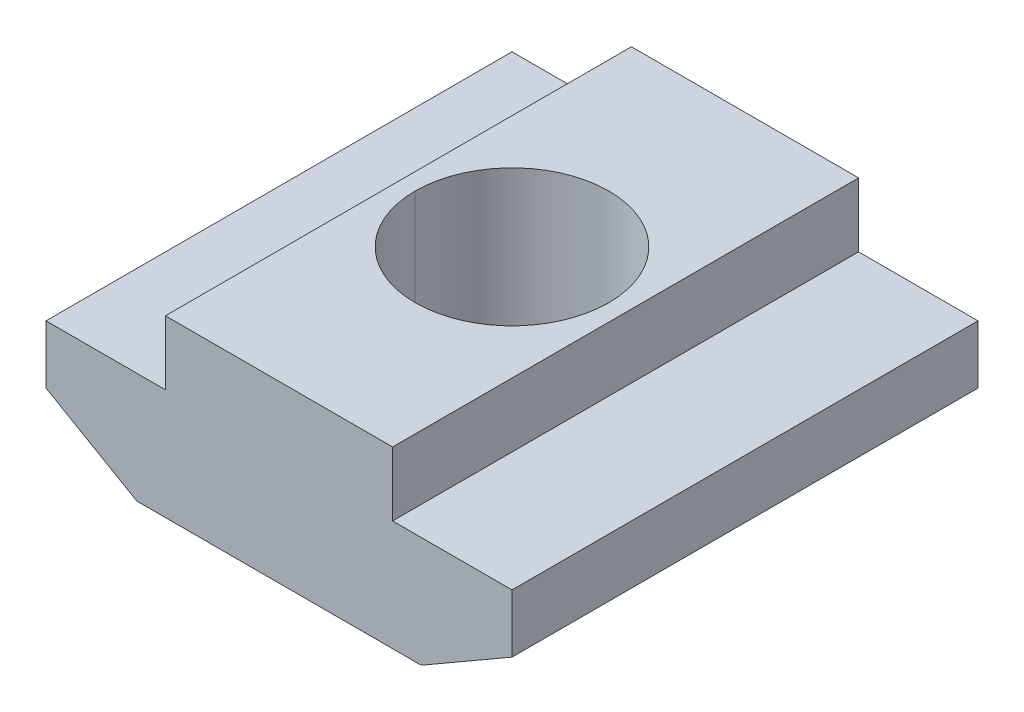
ISO-10303-21;
HEADER;
FILE_DESCRIPTION(('STEP AP214'),'2;1');
FILE_NAME('part.step','',(''),(''),'','','');
FILE_SCHEMA(('AUTOMOTIVE_DESIGN { 1 0 10303 214 1 1 1 1 }'));
ENDSEC;
DATA;
#1=APPLICATION_CONTEXT('core data for automotive mechanical design processes');
#2=APPLICATION_PROTOCOL_DEFINITION('international standard','automotive_design',2000,#1);
#3=PRODUCT_CONTEXT('',#1,'mechanical');
#4=PRODUCT('Part','Part','',(#3));
#5=PRODUCT_RELATED_PRODUCT_CATEGORY('part','',(#4));
#6=PRODUCT_DEFINITION_FORMATION('','',#4);
#7=PRODUCT_DEFINITION_CONTEXT('part definition',#1,'design');
#8=PRODUCT_DEFINITION('design','',#6,#7);
#9=PRODUCT_DEFINITION_SHAPE('','',#8);
#10=(LENGTH_UNIT() NAMED_UNIT(*) SI_UNIT(.MILLI.,.METRE.));
#11=(NAMED_UNIT(*) PLANE_ANGLE_UNIT() SI_UNIT($,.RADIAN.));
#12=(NAMED_UNIT(*) SI_UNIT($,.STERADIAN.) SOLID_ANGLE_UNIT());
#13=UNCERTAINTY_MEASURE_WITH_UNIT(LENGTH_MEASURE(1.E-05),#10,'distance_accuracy_value','');
#14=(GEOMETRIC_REPRESENTATION_CONTEXT(3) GLOBAL_UNCERTAINTY_ASSIGNED_CONTEXT((#13)) GLOBAL_UNIT_ASSIGNED_CONTEXT((#10,
#11,#12)) REPRESENTATION_CONTEXT('',''));
#15=CARTESIAN_POINT('',(0.,0.,0.));
#16=DIRECTION('',(0.,0.,1.));
#17=DIRECTION('',(1.,0.,0.));
#18=AXIS2_PLACEMENT_3D('',#15,#16,#17);
#19=CARTESIAN_POINT('',(-8.,-0.1,0.));
#20=DIRECTION('',(0.50000000000019,0.866025403784329,0.));
#21=DIRECTION('',(0.,0.,-1.));
#22=AXIS2_PLACEMENT_3D('',#19,#20,#21);
#23=PLANE('',#22);
#24=DIRECTION('',(0.,0.,1.));
#25=VECTOR('',#24,1.);
#26=CARTESIAN_POINT('',(-8.,-0.1,0.));
#27=LINE('',#26,#25);
#28=CARTESIAN_POINT('',(-8.,-0.1,-8.));
#29=VERTEX_POINT('',#28);
#30=CARTESIAN_POINT('',(-8.,-0.1,8.));
#31=VERTEX_POINT('',#30);
#32=EDGE_CURVE('E241',#29,#31,#27,.T.);
#33=ORIENTED_EDGE('',*,*,#32,.F.);
#34=DIRECTION('',(0.866025403784329,-0.50000000000019,0.));
#35=VECTOR('',#34,1.);
#36=CARTESIAN_POINT('',(-6.44115427319,-1.,-8.));
#37=LINE('',#36,#35);
#38=CARTESIAN_POINT('',(-4.88230854638,-1.9,-8.));
#39=VERTEX_POINT('',#38);
#40=EDGE_CURVE('E161',#29,#39,#37,.T.);
#41=ORIENTED_EDGE('',*,*,#40,.T.);
#42=DIRECTION('',(0.,0.,1.));
#43=VECTOR('',#42,1.);
#44=CARTESIAN_POINT('',(-4.88230854638,-1.9,0.));
#45=LINE('',#44,#43);
#46=CARTESIAN_POINT('',(-4.88230854638,-1.9,8.));
#47=VERTEX_POINT('',#46);
#48=EDGE_CURVE('E11',#39,#47,#45,.T.);
#49=ORIENTED_EDGE('',*,*,#48,.T.);
#50=DIRECTION('',(-0.866025403784329,0.50000000000019,0.));
#51=VECTOR('',#50,1.);
#52=CARTESIAN_POINT('',(-6.44115427319,-1.,8.));
#53=LINE('',#52,#51);
#54=EDGE_CURVE('E20',#47,#31,#53,.T.);
#55=ORIENTED_EDGE('',*,*,#54,.T.);
#56=EDGE_LOOP('',(#33,#41,#49,#55));
#57=FACE_BOUND('',#56,.T.);
#58=ADVANCED_FACE('F17',(#57),#23,.F.);
#59=CARTESIAN_POINT('',(8.,-1.9,0.));
#60=DIRECTION('',(0.,1.,0.));
#61=DIRECTION('',(1.,0.,0.));
#62=AXIS2_PLACEMENT_3D('',#59,#60,#61);
#63=PLANE('',#62);
#64=CARTESIAN_POINT('',(0.,-1.9,0.));
#65=DIRECTION('',(0.,1.,0.));
#66=DIRECTION('',(1.,0.,0.));
#67=AXIS2_PLACEMENT_3D('',#64,#65,#66);
#68=CIRCLE('',#67,3.3235);
#69=CARTESIAN_POINT('',(-3.3235,-1.9,0.));
#70=VERTEX_POINT('',#69);
#71=CARTESIAN_POINT('',(3.3235,-1.9,0.));
#72=VERTEX_POINT('',#71);
#73=EDGE_CURVE('E145',#70,#72,#68,.T.);
#74=ORIENTED_EDGE('',*,*,#73,.T.);
#75=CARTESIAN_POINT('',(0.,-1.9,0.));
#76=DIRECTION('',(0.,1.,0.));
#77=DIRECTION('',(1.,0.,0.));
#78=AXIS2_PLACEMENT_3D('',#75,#76,#77);
#79=CIRCLE('',#78,3.3235);
#80=EDGE_CURVE('E144',#72,#70,#79,.T.);
#81=ORIENTED_EDGE('',*,*,#80,.T.);
#82=EDGE_LOOP('',(#74,#81));
#83=FACE_BOUND('',#82,.T.);
#84=ORIENTED_EDGE('',*,*,#48,.F.);
#85=DIRECTION('',(1.,0.,0.));
#86=VECTOR('',#85,1.);
#87=CARTESIAN_POINT('',(0.,-1.9,-8.));
#88=LINE('',#87,#86);
#89=CARTESIAN_POINT('',(4.88230854638,-1.9,-8.));
#90=VERTEX_POINT('',#89);
#91=EDGE_CURVE('E163',#39,#90,#88,.T.);
#92=ORIENTED_EDGE('',*,*,#91,.T.);
#93=DIRECTION('',(0.,0.,1.));
#94=VECTOR('',#93,1.);
#95=CARTESIAN_POINT('',(4.88230854638,-1.9,0.));
#96=LINE('',#95,#94);
#97=CARTESIAN_POINT('',(4.88230854638,-1.9,8.));
#98=VERTEX_POINT('',#97);
#99=EDGE_CURVE('E213',#90,#98,#96,.T.);
#100=ORIENTED_EDGE('',*,*,#99,.T.);
#101=DIRECTION('',(1.,0.,0.));
#102=VECTOR('',#101,1.);
#103=CARTESIAN_POINT('',(0.,-1.9,8.));
#104=LINE('',#103,#102);
#105=EDGE_CURVE('E208',#47,#98,#104,.T.);
#106=ORIENTED_EDGE('',*,*,#105,.F.);
#107=EDGE_LOOP('',(#84,#92,#100,#106));
#108=FACE_BOUND('',#107,.T.);
#109=ADVANCED_FACE('F269',(#83,#108),#63,.F.);
#110=CARTESIAN_POINT('',(0.,0.,8.));
#111=DIRECTION('',(0.,0.,1.));
#112=DIRECTION('',(1.,0.,0.));
#113=AXIS2_PLACEMENT_3D('',#110,#111,#112);
#114=PLANE('',#113);
#115=ORIENTED_EDGE('',*,*,#105,.T.);
#116=DIRECTION('',(-0.866025403784329,-0.50000000000019,0.));
#117=VECTOR('',#116,1.);
#118=CARTESIAN_POINT('',(6.44115427319,-1.,8.));
#119=LINE('',#118,#117);
#120=CARTESIAN_POINT('',(8.,-0.1,8.));
#121=VERTEX_POINT('',#120);
#122=EDGE_CURVE('E246',#121,#98,#119,.T.);
#123=ORIENTED_EDGE('',*,*,#122,.F.);
#124=DIRECTION('',(0.,1.,0.));
#125=VECTOR('',#124,1.);
#126=CARTESIAN_POINT('',(8.,0.9,8.));
#127=LINE('',#126,#125);
#128=CARTESIAN_POINT('',(8.,1.9,8.));
#129=VERTEX_POINT('',#128);
#130=EDGE_CURVE('E171',#121,#129,#127,.T.);
#131=ORIENTED_EDGE('',*,*,#130,.T.);
#132=DIRECTION('',(-1.,0.,0.));
#133=VECTOR('',#132,1.);
#134=CARTESIAN_POINT('',(5.95,1.9,8.));
#135=LINE('',#134,#133);
#136=CARTESIAN_POINT('',(3.9,1.9,8.));
#137=VERTEX_POINT('',#136);
#138=EDGE_CURVE('E189',#129,#137,#135,.T.);
#139=ORIENTED_EDGE('',*,*,#138,.T.);
#140=DIRECTION('',(0.,1.,0.));
#141=VECTOR('',#140,1.);
#142=CARTESIAN_POINT('',(3.9,3.,8.));
#143=LINE('',#142,#141);
#144=CARTESIAN_POINT('',(3.9,4.1,8.));
#145=VERTEX_POINT('',#144);
#146=EDGE_CURVE('E233',#137,#145,#143,.T.);
#147=ORIENTED_EDGE('',*,*,#146,.T.);
#148=DIRECTION('',(-1.,0.,0.));
#149=VECTOR('',#148,1.);
#150=CARTESIAN_POINT('',(0.,4.1,8.));
#151=LINE('',#150,#149);
#152=CARTESIAN_POINT('',(-3.9,4.1,8.));
#153=VERTEX_POINT('',#152);
#154=EDGE_CURVE('E240',#145,#153,#151,.T.);
#155=ORIENTED_EDGE('',*,*,#154,.T.);
#156=DIRECTION('',(0.,-1.,0.));
#157=VECTOR('',#156,1.);
#158=CARTESIAN_POINT('',(-3.9,3.,8.));
#159=LINE('',#158,#157);
#160=CARTESIAN_POINT('',(-3.9,1.9,8.));
#161=VERTEX_POINT('',#160);
#162=EDGE_CURVE('E219',#153,#161,#159,.T.);
#163=ORIENTED_EDGE('',*,*,#162,.T.);
#164=DIRECTION('',(-1.,0.,0.));
#165=VECTOR('',#164,1.);
#166=CARTESIAN_POINT('',(-5.95,1.9,8.));
#167=LINE('',#166,#165);
#168=CARTESIAN_POINT('',(-8.,1.9,8.));
#169=VERTEX_POINT('',#168);
#170=EDGE_CURVE('E203',#161,#169,#167,.T.);
#171=ORIENTED_EDGE('',*,*,#170,.T.);
#172=DIRECTION('',(0.,-1.,0.));
#173=VECTOR('',#172,1.);
#174=CARTESIAN_POINT('',(-8.,0.9,8.));
#175=LINE('',#174,#173);
#176=EDGE_CURVE('E245',#169,#31,#175,.T.);
#177=ORIENTED_EDGE('',*,*,#176,.T.);
#178=ORIENTED_EDGE('',*,*,#54,.F.);
#179=EDGE_LOOP('',(#115,#123,#131,#139,#147,#155,#163,#171,#177,#178));
#180=FACE_BOUND('',#179,.T.);
#181=ADVANCED_FACE('F280',(#180),#114,.T.);
#182=CARTESIAN_POINT('',(0.,0.,-8.));
#183=DIRECTION('',(0.,0.,1.));
#184=DIRECTION('',(1.,0.,0.));
#185=AXIS2_PLACEMENT_3D('',#182,#183,#184);
#186=PLANE('',#185);
#187=ORIENTED_EDGE('',*,*,#40,.F.);
#188=DIRECTION('',(0.,-1.,0.));
#189=VECTOR('',#188,1.);
#190=CARTESIAN_POINT('',(-8.,0.9,-8.));
#191=LINE('',#190,#189);
#192=CARTESIAN_POINT('',(-8.,1.9,-8.));
#193=VERTEX_POINT('',#192);
#194=EDGE_CURVE('E164',#193,#29,#191,.T.);
#195=ORIENTED_EDGE('',*,*,#194,.F.);
#196=DIRECTION('',(-1.,0.,0.));
#197=VECTOR('',#196,1.);
#198=CARTESIAN_POINT('',(-5.95,1.9,-8.));
#199=LINE('',#198,#197);
#200=CARTESIAN_POINT('',(-3.9,1.9,-8.));
#201=VERTEX_POINT('',#200);
#202=EDGE_CURVE('E197',#201,#193,#199,.T.);
#203=ORIENTED_EDGE('',*,*,#202,.F.);
#204=DIRECTION('',(0.,-1.,0.));
#205=VECTOR('',#204,1.);
#206=CARTESIAN_POINT('',(-3.9,3.,-8.));
#207=LINE('',#206,#205);
#208=CARTESIAN_POINT('',(-3.9,4.1,-8.));
#209=VERTEX_POINT('',#208);
#210=EDGE_CURVE('E202',#209,#201,#207,.T.);
#211=ORIENTED_EDGE('',*,*,#210,.F.);
#212=DIRECTION('',(-1.,0.,0.));
#213=VECTOR('',#212,1.);
#214=CARTESIAN_POINT('',(0.,4.1,-8.));
#215=LINE('',#214,#213);
#216=CARTESIAN_POINT('',(3.9,4.1,-8.));
#217=VERTEX_POINT('',#216);
#218=EDGE_CURVE('E237',#217,#209,#215,.T.);
#219=ORIENTED_EDGE('',*,*,#218,.F.);
#220=DIRECTION('',(0.,1.,0.));
#221=VECTOR('',#220,1.);
#222=CARTESIAN_POINT('',(3.9,3.,-8.));
#223=LINE('',#222,#221);
#224=CARTESIAN_POINT('',(3.9,1.9,-8.));
#225=VERTEX_POINT('',#224);
#226=EDGE_CURVE('E225',#225,#217,#223,.T.);
#227=ORIENTED_EDGE('',*,*,#226,.F.);
#228=DIRECTION('',(-1.,0.,0.));
#229=VECTOR('',#228,1.);
#230=CARTESIAN_POINT('',(5.95,1.9,-8.));
#231=LINE('',#230,#229);
#232=CARTESIAN_POINT('',(8.,1.9,-8.));
#233=VERTEX_POINT('',#232);
#234=EDGE_CURVE('E181',#233,#225,#231,.T.);
#235=ORIENTED_EDGE('',*,*,#234,.F.);
#236=DIRECTION('',(0.,1.,0.));
#237=VECTOR('',#236,1.);
#238=CARTESIAN_POINT('',(8.,0.9,-8.));
#239=LINE('',#238,#237);
#240=CARTESIAN_POINT('',(8.,-0.1,-8.));
#241=VERTEX_POINT('',#240);
#242=EDGE_CURVE('E168',#241,#233,#239,.T.);
#243=ORIENTED_EDGE('',*,*,#242,.F.);
#244=DIRECTION('',(0.866025403784329,0.50000000000019,0.));
#245=VECTOR('',#244,1.);
#246=CARTESIAN_POINT('',(6.44115427319,-1.,-8.));
#247=LINE('',#246,#245);
#248=EDGE_CURVE('E255',#90,#241,#247,.T.);
#249=ORIENTED_EDGE('',*,*,#248,.F.);
#250=ORIENTED_EDGE('',*,*,#91,.F.);
#251=EDGE_LOOP('',(#187,#195,#203,#211,#219,#227,#235,#243,#249,#250));
#252=FACE_BOUND('',#251,.T.);
#253=ADVANCED_FACE('F273',(#252),#186,.F.);
#254=CARTESIAN_POINT('',(-8.,-1.9,0.));
#255=DIRECTION('',(1.,0.,0.));
#256=DIRECTION('',(0.,1.,0.));
#257=AXIS2_PLACEMENT_3D('',#254,#255,#256);
#258=PLANE('',#257);
#259=ORIENTED_EDGE('',*,*,#32,.T.);
#260=ORIENTED_EDGE('',*,*,#176,.F.);
#261=DIRECTION('',(0.,0.,1.));
#262=VECTOR('',#261,1.);
#263=CARTESIAN_POINT('',(-8.,1.9,0.));
#264=LINE('',#263,#262);
#265=EDGE_CURVE('E207',#193,#169,#264,.T.);
#266=ORIENTED_EDGE('',*,*,#265,.F.);
#267=ORIENTED_EDGE('',*,*,#194,.T.);
#268=EDGE_LOOP('',(#259,#260,#266,#267));
#269=FACE_BOUND('',#268,.T.);
#270=ADVANCED_FACE('F303',(#269),#258,.F.);
#271=CARTESIAN_POINT('',(8.,-0.1,0.));
#272=DIRECTION('',(-0.50000000000019,0.866025403784329,0.));
#273=DIRECTION('',(0.,0.,1.));
#274=AXIS2_PLACEMENT_3D('',#271,#272,#273);
#275=PLANE('',#274);
#276=ORIENTED_EDGE('',*,*,#99,.F.);
#277=ORIENTED_EDGE('',*,*,#248,.T.);
#278=DIRECTION('',(0.,0.,1.));
#279=VECTOR('',#278,1.);
#280=CARTESIAN_POINT('',(8.,-0.1,0.));
#281=LINE('',#280,#279);
#282=EDGE_CURVE('E172',#241,#121,#281,.T.);
#283=ORIENTED_EDGE('',*,*,#282,.T.);
#284=ORIENTED_EDGE('',*,*,#122,.T.);
#285=EDGE_LOOP('',(#276,#277,#283,#284));
#286=FACE_BOUND('',#285,.T.);
#287=ADVANCED_FACE('F277',(#286),#275,.F.);
#288=CARTESIAN_POINT('',(8.,1.9,0.));
#289=DIRECTION('',(-1.,0.,0.));
#290=DIRECTION('',(0.,0.,1.));
#291=AXIS2_PLACEMENT_3D('',#288,#289,#290);
#292=PLANE('',#291);
#293=ORIENTED_EDGE('',*,*,#282,.F.);
#294=ORIENTED_EDGE('',*,*,#242,.T.);
#295=DIRECTION('',(0.,0.,1.));
#296=VECTOR('',#295,1.);
#297=CARTESIAN_POINT('',(8.,1.9,0.));
#298=LINE('',#297,#296);
#299=EDGE_CURVE('E177',#233,#129,#298,.T.);
#300=ORIENTED_EDGE('',*,*,#299,.T.);
#301=ORIENTED_EDGE('',*,*,#130,.F.);
#302=EDGE_LOOP('',(#293,#294,#300,#301));
#303=FACE_BOUND('',#302,.T.);
#304=ADVANCED_FACE('F283',(#303),#292,.F.);
#305=CARTESIAN_POINT('',(-3.9,4.1,0.));
#306=DIRECTION('',(0.,-1.,0.));
#307=DIRECTION('',(0.,0.,-1.));
#308=AXIS2_PLACEMENT_3D('',#305,#306,#307);
#309=PLANE('',#308);
#310=CARTESIAN_POINT('',(0.,4.1,0.));
#311=DIRECTION('',(0.,-1.,0.));
#312=DIRECTION('',(1.,0.,0.));
#313=AXIS2_PLACEMENT_3D('',#310,#311,#312);
#314=CIRCLE('',#313,3.3235);
#315=CARTESIAN_POINT('',(3.3235,4.1,0.));
#316=VERTEX_POINT('',#315);
#317=CARTESIAN_POINT('',(-3.3235,4.1,0.));
#318=VERTEX_POINT('',#317);
#319=EDGE_CURVE('E147',#316,#318,#314,.T.);
#320=ORIENTED_EDGE('',*,*,#319,.T.);
#321=CARTESIAN_POINT('',(0.,4.1,0.));
#322=DIRECTION('',(0.,-1.,0.));
#323=DIRECTION('',(1.,0.,0.));
#324=AXIS2_PLACEMENT_3D('',#321,#322,#323);
#325=CIRCLE('',#324,3.3235);
#326=EDGE_CURVE('E134',#318,#316,#325,.T.);
#327=ORIENTED_EDGE('',*,*,#326,.T.);
#328=EDGE_LOOP('',(#320,#327));
#329=FACE_BOUND('',#328,.T.);
#330=DIRECTION('',(0.,0.,1.));
#331=VECTOR('',#330,1.);
#332=CARTESIAN_POINT('',(3.9,4.1,0.));
#333=LINE('',#332,#331);
#334=EDGE_CURVE('E229',#217,#145,#333,.T.);
#335=ORIENTED_EDGE('',*,*,#334,.F.);
#336=ORIENTED_EDGE('',*,*,#218,.T.);
#337=DIRECTION('',(0.,0.,1.));
#338=VECTOR('',#337,1.);
#339=CARTESIAN_POINT('',(-3.9,4.1,0.));
#340=LINE('',#339,#338);
#341=EDGE_CURVE('E198',#209,#153,#340,.T.);
#342=ORIENTED_EDGE('',*,*,#341,.T.);
#343=ORIENTED_EDGE('',*,*,#154,.F.);
#344=EDGE_LOOP('',(#335,#336,#342,#343));
#345=FACE_BOUND('',#344,.T.);
#346=ADVANCED_FACE('F148',(#329,#345),#309,.F.);
#347=CARTESIAN_POINT('',(3.9,4.1,0.));
#348=DIRECTION('',(-1.,0.,0.));
#349=DIRECTION('',(0.,0.,1.));
#350=AXIS2_PLACEMENT_3D('',#347,#348,#349);
#351=PLANE('',#350);
#352=DIRECTION('',(0.,0.,1.));
#353=VECTOR('',#352,1.);
#354=CARTESIAN_POINT('',(3.9,1.9,0.));
#355=LINE('',#354,#353);
#356=EDGE_CURVE('E185',#225,#137,#355,.T.);
#357=ORIENTED_EDGE('',*,*,#356,.F.);
#358=ORIENTED_EDGE('',*,*,#226,.T.);
#359=ORIENTED_EDGE('',*,*,#334,.T.);
#360=ORIENTED_EDGE('',*,*,#146,.F.);
#361=EDGE_LOOP('',(#357,#358,#359,#360));
#362=FACE_BOUND('',#361,.T.);
#363=ADVANCED_FACE('F291',(#362),#351,.F.);
#364=CARTESIAN_POINT('',(-3.9,1.9,0.));
#365=DIRECTION('',(1.,0.,0.));
#366=DIRECTION('',(0.,1.,0.));
#367=AXIS2_PLACEMENT_3D('',#364,#365,#366);
#368=PLANE('',#367);
#369=ORIENTED_EDGE('',*,*,#341,.F.);
#370=ORIENTED_EDGE('',*,*,#210,.T.);
#371=DIRECTION('',(0.,0.,1.));
#372=VECTOR('',#371,1.);
#373=CARTESIAN_POINT('',(-3.9,1.9,0.));
#374=LINE('',#373,#372);
#375=EDGE_CURVE('E193',#201,#161,#374,.T.);
#376=ORIENTED_EDGE('',*,*,#375,.T.);
#377=ORIENTED_EDGE('',*,*,#162,.F.);
#378=EDGE_LOOP('',(#369,#370,#376,#377));
#379=FACE_BOUND('',#378,.T.);
#380=ADVANCED_FACE('F295',(#379),#368,.F.);
#381=CARTESIAN_POINT('',(3.9,1.9,0.));
#382=DIRECTION('',(0.,-1.,0.));
#383=DIRECTION('',(0.,0.,-1.));
#384=AXIS2_PLACEMENT_3D('',#381,#382,#383);
#385=PLANE('',#384);
#386=ORIENTED_EDGE('',*,*,#375,.F.);
#387=ORIENTED_EDGE('',*,*,#202,.T.);
#388=ORIENTED_EDGE('',*,*,#265,.T.);
#389=ORIENTED_EDGE('',*,*,#170,.F.);
#390=EDGE_LOOP('',(#386,#387,#388,#389));
#391=FACE_BOUND('',#390,.T.);
#392=ADVANCED_FACE('F300',(#391),#385,.F.);
#393=CARTESIAN_POINT('',(3.9,1.9,0.));
#394=DIRECTION('',(0.,-1.,0.));
#395=DIRECTION('',(0.,0.,-1.));
#396=AXIS2_PLACEMENT_3D('',#393,#394,#395);
#397=PLANE('',#396);
#398=ORIENTED_EDGE('',*,*,#299,.F.);
#399=ORIENTED_EDGE('',*,*,#234,.T.);
#400=ORIENTED_EDGE('',*,*,#356,.T.);
#401=ORIENTED_EDGE('',*,*,#138,.F.);
#402=EDGE_LOOP('',(#398,#399,#400,#401));
#403=FACE_BOUND('',#402,.T.);
#404=ADVANCED_FACE('F286',(#403),#397,.F.);
#405=CARTESIAN_POINT('',(0.,-1.9,0.));
#406=DIRECTION('',(0.,1.,0.));
#407=DIRECTION('',(1.,0.,0.));
#408=AXIS2_PLACEMENT_3D('',#405,#406,#407);
#409=CYLINDRICAL_SURFACE('',#408,3.3235);
#410=DIRECTION('',(0.,-1.,0.));
#411=VECTOR('',#410,1.);
#412=CARTESIAN_POINT('',(3.3235,2.94499999997,0.));
#413=LINE('',#412,#411);
#414=EDGE_CURVE('E140',#316,#72,#413,.T.);
#415=ORIENTED_EDGE('',*,*,#414,.F.);
#416=ORIENTED_EDGE('',*,*,#326,.F.);
#417=DIRECTION('',(0.,-1.,0.));
#418=VECTOR('',#417,1.);
#419=CARTESIAN_POINT('',(-3.3235,2.94499999997,0.));
#420=LINE('',#419,#418);
#421=EDGE_CURVE('E138',#318,#70,#420,.T.);
#422=ORIENTED_EDGE('',*,*,#421,.T.);
#423=ORIENTED_EDGE('',*,*,#80,.F.);
#424=EDGE_LOOP('',(#415,#416,#422,#423));
#425=FACE_BOUND('',#424,.T.);
#426=ADVANCED_FACE('F136',(#425),#409,.F.);
#427=CARTESIAN_POINT('',(0.,-1.9,0.));
#428=DIRECTION('',(0.,1.,0.));
#429=DIRECTION('',(1.,0.,0.));
#430=AXIS2_PLACEMENT_3D('',#427,#428,#429);
#431=CYLINDRICAL_SURFACE('',#430,3.3235);
#432=ORIENTED_EDGE('',*,*,#421,.F.);
#433=ORIENTED_EDGE('',*,*,#319,.F.);
#434=ORIENTED_EDGE('',*,*,#414,.T.);
#435=ORIENTED_EDGE('',*,*,#73,.F.);
#436=EDGE_LOOP('',(#432,#433,#434,#435));
#437=FACE_BOUND('',#436,.T.);
#438=ADVANCED_FACE('F154',(#437),#431,.F.);
#439=CLOSED_SHELL('',(#58,#109,#181,#253,#270,#287,#304,#346,#363,#380,#392,#404,#426,#438));
#440=MANIFOLD_SOLID_BREP('B1',#439);
#441=ADVANCED_BREP_SHAPE_REPRESENTATION('',(#18,#440),#14);
#442=SHAPE_DEFINITION_REPRESENTATION(#9,#441);
ENDSEC;
END-ISO-10303-21;
